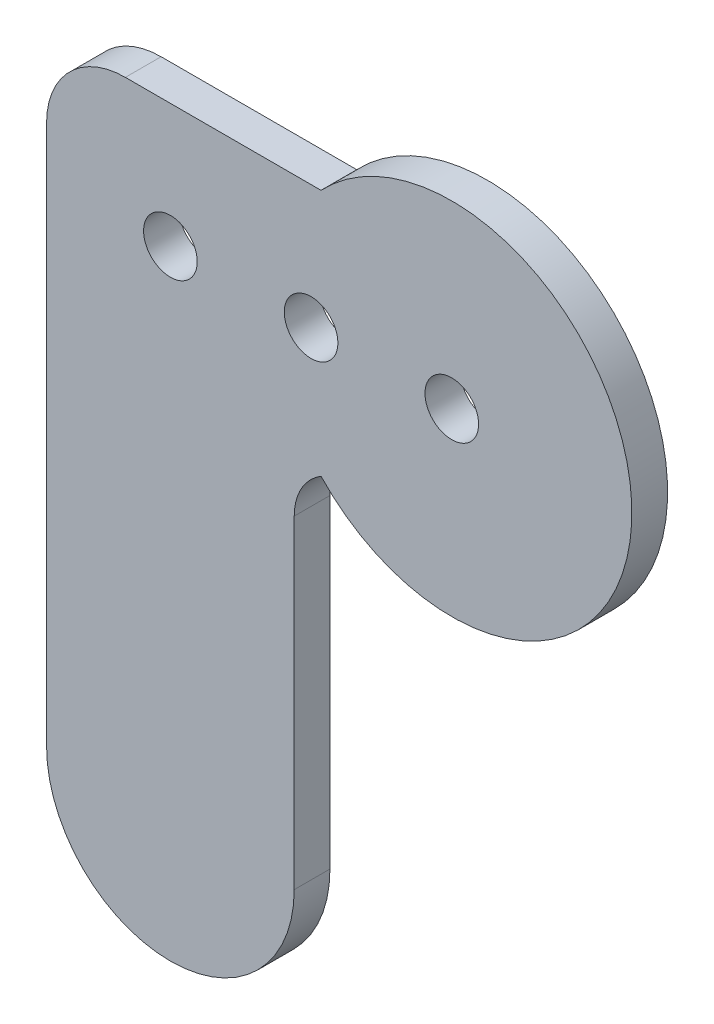
ISO-10303-21;
HEADER;
FILE_DESCRIPTION(('STEP AP214'),'2;1');
FILE_NAME('part.step','',(''),(''),'','','');
FILE_SCHEMA(('AUTOMOTIVE_DESIGN { 1 0 10303 214 1 1 1 1 }'));
ENDSEC;
DATA;
#1=APPLICATION_CONTEXT('core data for automotive mechanical design processes');
#2=APPLICATION_PROTOCOL_DEFINITION('international standard','automotive_design',2000,#1);
#3=PRODUCT_CONTEXT('',#1,'mechanical');
#4=PRODUCT('Part','Part','',(#3));
#5=PRODUCT_RELATED_PRODUCT_CATEGORY('part','',(#4));
#6=PRODUCT_DEFINITION_FORMATION('','',#4);
#7=PRODUCT_DEFINITION_CONTEXT('part definition',#1,'design');
#8=PRODUCT_DEFINITION('design','',#6,#7);
#9=PRODUCT_DEFINITION_SHAPE('','',#8);
#10=(LENGTH_UNIT() NAMED_UNIT(*) SI_UNIT(.MILLI.,.METRE.));
#11=(NAMED_UNIT(*) PLANE_ANGLE_UNIT() SI_UNIT($,.RADIAN.));
#12=(NAMED_UNIT(*) SI_UNIT($,.STERADIAN.) SOLID_ANGLE_UNIT());
#13=UNCERTAINTY_MEASURE_WITH_UNIT(LENGTH_MEASURE(1.E-05),#10,'distance_accuracy_value','');
#14=(GEOMETRIC_REPRESENTATION_CONTEXT(3) GLOBAL_UNCERTAINTY_ASSIGNED_CONTEXT((#13)) GLOBAL_UNIT_ASSIGNED_CONTEXT((#10,
#11,#12)) REPRESENTATION_CONTEXT('',''));
#15=CARTESIAN_POINT('',(0.,0.,0.));
#16=DIRECTION('',(0.,0.,1.));
#17=DIRECTION('',(1.,0.,0.));
#18=AXIS2_PLACEMENT_3D('',#15,#16,#17);
#19=CARTESIAN_POINT('',(0.,0.,3.175));
#20=DIRECTION('',(0.,0.,-1.));
#21=DIRECTION('',(-1.,0.,0.));
#22=AXIS2_PLACEMENT_3D('',#19,#20,#21);
#23=CYLINDRICAL_SURFACE('',#22,16.);
#24=CARTESIAN_POINT('',(0.,0.,0.));
#25=DIRECTION('',(0.,0.,1.));
#26=DIRECTION('',(1.,0.,0.));
#27=AXIS2_PLACEMENT_3D('',#24,#25,#26);
#28=CIRCLE('',#27,16.);
#29=CARTESIAN_POINT('',(-11.6189500386223,-11.,0.));
#30=VERTEX_POINT('',#29);
#31=CARTESIAN_POINT('',(-11.6189500386223,11.,0.));
#32=VERTEX_POINT('',#31);
#33=EDGE_CURVE('E115',#30,#32,#28,.T.);
#34=ORIENTED_EDGE('',*,*,#33,.T.);
#35=DIRECTION('',(0.,0.,-1.));
#36=VECTOR('',#35,1.);
#37=CARTESIAN_POINT('',(-11.6189500386223,11.,3.175));
#38=LINE('',#37,#36);
#39=CARTESIAN_POINT('',(-11.6189500386223,11.,3.175));
#40=VERTEX_POINT('',#39);
#41=EDGE_CURVE('E98',#40,#32,#38,.T.);
#42=ORIENTED_EDGE('',*,*,#41,.F.);
#43=CARTESIAN_POINT('',(0.,0.,3.175));
#44=DIRECTION('',(0.,0.,1.));
#45=DIRECTION('',(1.,0.,0.));
#46=AXIS2_PLACEMENT_3D('',#43,#44,#45);
#47=CIRCLE('',#46,16.);
#48=CARTESIAN_POINT('',(-11.6189500386223,-11.,3.175));
#49=VERTEX_POINT('',#48);
#50=EDGE_CURVE('E105',#49,#40,#47,.T.);
#51=ORIENTED_EDGE('',*,*,#50,.F.);
#52=DIRECTION('',(0.,0.,-1.));
#53=VECTOR('',#52,1.);
#54=CARTESIAN_POINT('',(-11.6189500386223,-11.,3.175));
#55=LINE('',#54,#53);
#56=EDGE_CURVE('E155',#49,#30,#55,.T.);
#57=ORIENTED_EDGE('',*,*,#56,.T.);
#58=EDGE_LOOP('',(#34,#42,#51,#57));
#59=FACE_BOUND('',#58,.T.);
#60=ADVANCED_FACE('F34',(#59),#23,.T.);
#61=CARTESIAN_POINT('',(-11.6189500386223,11.,3.175));
#62=DIRECTION('',(0.,-1.,0.));
#63=DIRECTION('',(1.,0.,0.));
#64=AXIS2_PLACEMENT_3D('',#61,#62,#63);
#65=PLANE('',#64);
#66=DIRECTION('',(-1.,0.,0.));
#67=VECTOR('',#66,1.);
#68=CARTESIAN_POINT('',(-11.6189500386223,11.,0.));
#69=LINE('',#68,#67);
#70=CARTESIAN_POINT('',(-29.,11.,0.));
#71=VERTEX_POINT('',#70);
#72=EDGE_CURVE('E143',#32,#71,#69,.T.);
#73=ORIENTED_EDGE('',*,*,#72,.T.);
#74=DIRECTION('',(0.,0.,-1.));
#75=VECTOR('',#74,1.);
#76=CARTESIAN_POINT('',(-29.,11.,3.175));
#77=LINE('',#76,#75);
#78=CARTESIAN_POINT('',(-29.,11.,3.175));
#79=VERTEX_POINT('',#78);
#80=EDGE_CURVE('E101',#71,#79,#77,.F.);
#81=ORIENTED_EDGE('',*,*,#80,.T.);
#82=DIRECTION('',(-1.,0.,0.));
#83=VECTOR('',#82,1.);
#84=CARTESIAN_POINT('',(-11.6189500386223,11.,3.175));
#85=LINE('',#84,#83);
#86=EDGE_CURVE('E93',#40,#79,#85,.T.);
#87=ORIENTED_EDGE('',*,*,#86,.F.);
#88=ORIENTED_EDGE('',*,*,#41,.T.);
#89=EDGE_LOOP('',(#73,#81,#87,#88));
#90=FACE_BOUND('',#89,.T.);
#91=ADVANCED_FACE('F96',(#90),#65,.F.);
#92=CARTESIAN_POINT('',(-36.,11.,3.175));
#93=DIRECTION('',(1.,0.,0.));
#94=DIRECTION('',(0.,1.,0.));
#95=AXIS2_PLACEMENT_3D('',#92,#93,#94);
#96=PLANE('',#95);
#97=DIRECTION('',(0.,-1.,0.));
#98=VECTOR('',#97,1.);
#99=CARTESIAN_POINT('',(-36.,11.,3.175));
#100=LINE('',#99,#98);
#101=CARTESIAN_POINT('',(-36.,3.99999999999999,3.175));
#102=VERTEX_POINT('',#101);
#103=CARTESIAN_POINT('',(-36.,-44.,3.175));
#104=VERTEX_POINT('',#103);
#105=EDGE_CURVE('E104',#102,#104,#100,.T.);
#106=ORIENTED_EDGE('',*,*,#105,.F.);
#107=DIRECTION('',(0.,0.,-1.));
#108=VECTOR('',#107,1.);
#109=CARTESIAN_POINT('',(-36.,3.99999999999999,3.175));
#110=LINE('',#109,#108);
#111=CARTESIAN_POINT('',(-36.,3.99999999999999,0.));
#112=VERTEX_POINT('',#111);
#113=EDGE_CURVE('E116',#102,#112,#110,.T.);
#114=ORIENTED_EDGE('',*,*,#113,.T.);
#115=DIRECTION('',(0.,-1.,0.));
#116=VECTOR('',#115,1.);
#117=CARTESIAN_POINT('',(-36.,11.,0.));
#118=LINE('',#117,#116);
#119=CARTESIAN_POINT('',(-36.,-44.,0.));
#120=VERTEX_POINT('',#119);
#121=EDGE_CURVE('E145',#112,#120,#118,.T.);
#122=ORIENTED_EDGE('',*,*,#121,.T.);
#123=DIRECTION('',(0.,0.,-1.));
#124=VECTOR('',#123,1.);
#125=CARTESIAN_POINT('',(-36.,-44.,3.175));
#126=LINE('',#125,#124);
#127=EDGE_CURVE('E117',#104,#120,#126,.T.);
#128=ORIENTED_EDGE('',*,*,#127,.F.);
#129=EDGE_LOOP('',(#106,#114,#122,#128));
#130=FACE_BOUND('',#129,.T.);
#131=ADVANCED_FACE('F136',(#130),#96,.F.);
#132=CARTESIAN_POINT('',(-25.,-44.,3.175));
#133=DIRECTION('',(0.,0.,-1.));
#134=DIRECTION('',(-1.,0.,0.));
#135=AXIS2_PLACEMENT_3D('',#132,#133,#134);
#136=CYLINDRICAL_SURFACE('',#135,11.);
#137=CARTESIAN_POINT('',(-25.,-44.,0.));
#138=DIRECTION('',(0.,0.,1.));
#139=DIRECTION('',(1.,0.,0.));
#140=AXIS2_PLACEMENT_3D('',#137,#138,#139);
#141=CIRCLE('',#140,11.);
#142=CARTESIAN_POINT('',(-14.,-44.,0.));
#143=VERTEX_POINT('',#142);
#144=EDGE_CURVE('E147',#120,#143,#141,.T.);
#145=ORIENTED_EDGE('',*,*,#144,.T.);
#146=DIRECTION('',(0.,0.,-1.));
#147=VECTOR('',#146,1.);
#148=CARTESIAN_POINT('',(-14.,-44.,3.175));
#149=LINE('',#148,#147);
#150=CARTESIAN_POINT('',(-14.,-44.,3.175));
#151=VERTEX_POINT('',#150);
#152=EDGE_CURVE('E123',#151,#143,#149,.T.);
#153=ORIENTED_EDGE('',*,*,#152,.F.);
#154=CARTESIAN_POINT('',(-25.,-44.,3.175));
#155=DIRECTION('',(0.,0.,1.));
#156=DIRECTION('',(1.,0.,0.));
#157=AXIS2_PLACEMENT_3D('',#154,#155,#156);
#158=CIRCLE('',#157,11.);
#159=EDGE_CURVE('E139',#104,#151,#158,.T.);
#160=ORIENTED_EDGE('',*,*,#159,.F.);
#161=ORIENTED_EDGE('',*,*,#127,.T.);
#162=EDGE_LOOP('',(#145,#153,#160,#161));
#163=FACE_BOUND('',#162,.T.);
#164=ADVANCED_FACE('F161',(#163),#136,.T.);
#165=CARTESIAN_POINT('',(-14.,-44.,3.175));
#166=DIRECTION('',(-1.,0.,0.));
#167=DIRECTION('',(0.,-1.,0.));
#168=AXIS2_PLACEMENT_3D('',#165,#166,#167);
#169=PLANE('',#168);
#170=DIRECTION('',(0.,1.,0.));
#171=VECTOR('',#170,1.);
#172=CARTESIAN_POINT('',(-14.,-44.,0.));
#173=LINE('',#172,#171);
#174=CARTESIAN_POINT('',(-14.,-15.2592371024868,0.));
#175=VERTEX_POINT('',#174);
#176=EDGE_CURVE('E113',#143,#175,#173,.T.);
#177=ORIENTED_EDGE('',*,*,#176,.T.);
#178=DIRECTION('',(0.,0.,-1.));
#179=VECTOR('',#178,1.);
#180=CARTESIAN_POINT('',(-14.,-15.2592371024868,3.175));
#181=LINE('',#180,#179);
#182=CARTESIAN_POINT('',(-14.,-15.2592371024868,3.175));
#183=VERTEX_POINT('',#182);
#184=EDGE_CURVE('E49',#175,#183,#181,.F.);
#185=ORIENTED_EDGE('',*,*,#184,.T.);
#186=DIRECTION('',(0.,1.,0.));
#187=VECTOR('',#186,1.);
#188=CARTESIAN_POINT('',(-14.,-44.,3.175));
#189=LINE('',#188,#187);
#190=EDGE_CURVE('E156',#151,#183,#189,.T.);
#191=ORIENTED_EDGE('',*,*,#190,.F.);
#192=ORIENTED_EDGE('',*,*,#152,.T.);
#193=EDGE_LOOP('',(#177,#185,#191,#192));
#194=FACE_BOUND('',#193,.T.);
#195=ADVANCED_FACE('F159',(#194),#169,.F.);
#196=CARTESIAN_POINT('',(0.,0.,3.175));
#197=DIRECTION('',(0.,0.,1.));
#198=DIRECTION('',(1.,0.,0.));
#199=AXIS2_PLACEMENT_3D('',#196,#197,#198);
#200=PLANE('',#199);
#201=CARTESIAN_POINT('',(-12.5,0.,3.175));
#202=DIRECTION('',(0.,0.,1.));
#203=DIRECTION('',(1.,0.,0.));
#204=AXIS2_PLACEMENT_3D('',#201,#202,#203);
#205=CIRCLE('',#204,2.38125);
#206=CARTESIAN_POINT('',(-10.11875,0.,3.175));
#207=VERTEX_POINT('',#206);
#208=EDGE_CURVE('E176',#207,#207,#205,.T.);
#209=ORIENTED_EDGE('',*,*,#208,.F.);
#210=EDGE_LOOP('',(#209));
#211=FACE_BOUND('',#210,.T.);
#212=CARTESIAN_POINT('',(-25.,0.,3.175));
#213=DIRECTION('',(0.,0.,1.));
#214=DIRECTION('',(1.,0.,0.));
#215=AXIS2_PLACEMENT_3D('',#212,#213,#214);
#216=CIRCLE('',#215,2.38125);
#217=CARTESIAN_POINT('',(-22.61875,0.,3.175));
#218=VERTEX_POINT('',#217);
#219=EDGE_CURVE('E170',#218,#218,#216,.T.);
#220=ORIENTED_EDGE('',*,*,#219,.F.);
#221=EDGE_LOOP('',(#220));
#222=FACE_BOUND('',#221,.T.);
#223=CARTESIAN_POINT('',(0.,0.,3.175));
#224=DIRECTION('',(0.,0.,1.));
#225=DIRECTION('',(1.,0.,0.));
#226=AXIS2_PLACEMENT_3D('',#223,#224,#225);
#227=CIRCLE('',#226,2.38125);
#228=CARTESIAN_POINT('',(2.38125,0.,3.175));
#229=VERTEX_POINT('',#228);
#230=EDGE_CURVE('E164',#229,#229,#227,.T.);
#231=ORIENTED_EDGE('',*,*,#230,.F.);
#232=EDGE_LOOP('',(#231));
#233=FACE_BOUND('',#232,.T.);
#234=ORIENTED_EDGE('',*,*,#86,.T.);
#235=CARTESIAN_POINT('',(-29.,3.99999999999999,3.175));
#236=DIRECTION('',(0.,0.,1.));
#237=DIRECTION('',(1.,0.,0.));
#238=AXIS2_PLACEMENT_3D('',#235,#236,#237);
#239=CIRCLE('',#238,7.);
#240=EDGE_CURVE('E129',#79,#102,#239,.T.);
#241=ORIENTED_EDGE('',*,*,#240,.T.);
#242=ORIENTED_EDGE('',*,*,#105,.T.);
#243=ORIENTED_EDGE('',*,*,#159,.T.);
#244=ORIENTED_EDGE('',*,*,#190,.T.);
#245=CARTESIAN_POINT('',(-9.00000000000001,-15.2592371024868,3.175));
#246=DIRECTION('',(0.,0.,1.));
#247=DIRECTION('',(1.,0.,0.));
#248=AXIS2_PLACEMENT_3D('',#245,#246,#247);
#249=CIRCLE('',#248,5.);
#250=EDGE_CURVE('E11',#183,#49,#249,.F.);
#251=ORIENTED_EDGE('',*,*,#250,.T.);
#252=ORIENTED_EDGE('',*,*,#50,.T.);
#253=EDGE_LOOP('',(#234,#241,#242,#243,#244,#251,#252));
#254=FACE_BOUND('',#253,.T.);
#255=ADVANCED_FACE('F108',(#211,#222,#233,#254),#200,.T.);
#256=CARTESIAN_POINT('',(0.,0.,0.));
#257=DIRECTION('',(0.,0.,1.));
#258=DIRECTION('',(1.,0.,0.));
#259=AXIS2_PLACEMENT_3D('',#256,#257,#258);
#260=PLANE('',#259);
#261=CARTESIAN_POINT('',(-12.5,0.,0.));
#262=DIRECTION('',(0.,0.,1.));
#263=DIRECTION('',(1.,0.,0.));
#264=AXIS2_PLACEMENT_3D('',#261,#262,#263);
#265=CIRCLE('',#264,2.38125);
#266=CARTESIAN_POINT('',(-10.11875,0.,0.));
#267=VERTEX_POINT('',#266);
#268=EDGE_CURVE('E167',#267,#267,#265,.T.);
#269=ORIENTED_EDGE('',*,*,#268,.T.);
#270=EDGE_LOOP('',(#269));
#271=FACE_BOUND('',#270,.T.);
#272=CARTESIAN_POINT('',(-25.,0.,0.));
#273=DIRECTION('',(0.,0.,1.));
#274=DIRECTION('',(1.,0.,0.));
#275=AXIS2_PLACEMENT_3D('',#272,#273,#274);
#276=CIRCLE('',#275,2.38125);
#277=CARTESIAN_POINT('',(-22.61875,0.,0.));
#278=VERTEX_POINT('',#277);
#279=EDGE_CURVE('E173',#278,#278,#276,.T.);
#280=ORIENTED_EDGE('',*,*,#279,.T.);
#281=EDGE_LOOP('',(#280));
#282=FACE_BOUND('',#281,.T.);
#283=CARTESIAN_POINT('',(0.,0.,0.));
#284=DIRECTION('',(0.,0.,1.));
#285=DIRECTION('',(1.,0.,0.));
#286=AXIS2_PLACEMENT_3D('',#283,#284,#285);
#287=CIRCLE('',#286,2.38125);
#288=CARTESIAN_POINT('',(2.38125,0.,0.));
#289=VERTEX_POINT('',#288);
#290=EDGE_CURVE('E149',#289,#289,#287,.T.);
#291=ORIENTED_EDGE('',*,*,#290,.T.);
#292=EDGE_LOOP('',(#291));
#293=FACE_BOUND('',#292,.T.);
#294=ORIENTED_EDGE('',*,*,#121,.F.);
#295=CARTESIAN_POINT('',(-29.,3.99999999999999,0.));
#296=DIRECTION('',(0.,0.,1.));
#297=DIRECTION('',(1.,0.,0.));
#298=AXIS2_PLACEMENT_3D('',#295,#296,#297);
#299=CIRCLE('',#298,7.);
#300=EDGE_CURVE('E120',#112,#71,#299,.F.);
#301=ORIENTED_EDGE('',*,*,#300,.T.);
#302=ORIENTED_EDGE('',*,*,#72,.F.);
#303=ORIENTED_EDGE('',*,*,#33,.F.);
#304=CARTESIAN_POINT('',(-9.00000000000001,-15.2592371024868,0.));
#305=DIRECTION('',(0.,0.,1.));
#306=DIRECTION('',(1.,0.,0.));
#307=AXIS2_PLACEMENT_3D('',#304,#305,#306);
#308=CIRCLE('',#307,5.);
#309=EDGE_CURVE('E42',#30,#175,#308,.T.);
#310=ORIENTED_EDGE('',*,*,#309,.T.);
#311=ORIENTED_EDGE('',*,*,#176,.F.);
#312=ORIENTED_EDGE('',*,*,#144,.F.);
#313=EDGE_LOOP('',(#294,#301,#302,#303,#310,#311,#312));
#314=FACE_BOUND('',#313,.T.);
#315=ADVANCED_FACE('F142',(#271,#282,#293,#314),#260,.F.);
#316=CARTESIAN_POINT('',(-29.,3.99999999999999,3.175));
#317=DIRECTION('',(0.,0.,-1.));
#318=DIRECTION('',(-1.,0.,0.));
#319=AXIS2_PLACEMENT_3D('',#316,#317,#318);
#320=CYLINDRICAL_SURFACE('',#319,7.);
#321=ORIENTED_EDGE('',*,*,#240,.F.);
#322=ORIENTED_EDGE('',*,*,#80,.F.);
#323=ORIENTED_EDGE('',*,*,#300,.F.);
#324=ORIENTED_EDGE('',*,*,#113,.F.);
#325=EDGE_LOOP('',(#321,#322,#323,#324));
#326=FACE_BOUND('',#325,.T.);
#327=ADVANCED_FACE('F141',(#326),#320,.T.);
#328=CARTESIAN_POINT('',(-9.00000000000001,-15.2592371024868,3.175));
#329=DIRECTION('',(0.,0.,-1.));
#330=DIRECTION('',(-1.,0.,0.));
#331=AXIS2_PLACEMENT_3D('',#328,#329,#330);
#332=CYLINDRICAL_SURFACE('',#331,5.);
#333=ORIENTED_EDGE('',*,*,#250,.F.);
#334=ORIENTED_EDGE('',*,*,#184,.F.);
#335=ORIENTED_EDGE('',*,*,#309,.F.);
#336=ORIENTED_EDGE('',*,*,#56,.F.);
#337=EDGE_LOOP('',(#333,#334,#335,#336));
#338=FACE_BOUND('',#337,.T.);
#339=ADVANCED_FACE('F36',(#338),#332,.F.);
#340=CARTESIAN_POINT('',(0.,0.,0.));
#341=DIRECTION('',(0.,0.,1.));
#342=DIRECTION('',(1.,0.,0.));
#343=AXIS2_PLACEMENT_3D('',#340,#341,#342);
#344=CYLINDRICAL_SURFACE('',#343,2.38125);
#345=ORIENTED_EDGE('',*,*,#290,.F.);
#346=EDGE_LOOP('',(#345));
#347=FACE_BOUND('',#346,.T.);
#348=ORIENTED_EDGE('',*,*,#230,.T.);
#349=EDGE_LOOP('',(#348));
#350=FACE_BOUND('',#349,.T.);
#351=ADVANCED_FACE('F198',(#347,#350),#344,.F.);
#352=CARTESIAN_POINT('',(-25.,0.,0.));
#353=DIRECTION('',(0.,0.,1.));
#354=DIRECTION('',(1.,0.,0.));
#355=AXIS2_PLACEMENT_3D('',#352,#353,#354);
#356=CYLINDRICAL_SURFACE('',#355,2.38125);
#357=ORIENTED_EDGE('',*,*,#279,.F.);
#358=EDGE_LOOP('',(#357));
#359=FACE_BOUND('',#358,.T.);
#360=ORIENTED_EDGE('',*,*,#219,.T.);
#361=EDGE_LOOP('',(#360));
#362=FACE_BOUND('',#361,.T.);
#363=ADVANCED_FACE('F187',(#359,#362),#356,.F.);
#364=CARTESIAN_POINT('',(-12.5,0.,0.));
#365=DIRECTION('',(0.,0.,1.));
#366=DIRECTION('',(1.,0.,0.));
#367=AXIS2_PLACEMENT_3D('',#364,#365,#366);
#368=CYLINDRICAL_SURFACE('',#367,2.38125);
#369=ORIENTED_EDGE('',*,*,#268,.F.);
#370=EDGE_LOOP('',(#369));
#371=FACE_BOUND('',#370,.T.);
#372=ORIENTED_EDGE('',*,*,#208,.T.);
#373=EDGE_LOOP('',(#372));
#374=FACE_BOUND('',#373,.T.);
#375=ADVANCED_FACE('F184',(#371,#374),#368,.F.);
#376=CLOSED_SHELL('',(#60,#91,#131,#164,#195,#255,#315,#327,#339,#351,#363,#375));
#377=MANIFOLD_SOLID_BREP('B2',#376);
#378=ADVANCED_BREP_SHAPE_REPRESENTATION('',(#18,#377),#14);
#379=SHAPE_DEFINITION_REPRESENTATION(#9,#378);
ENDSEC;
END-ISO-10303-21;
